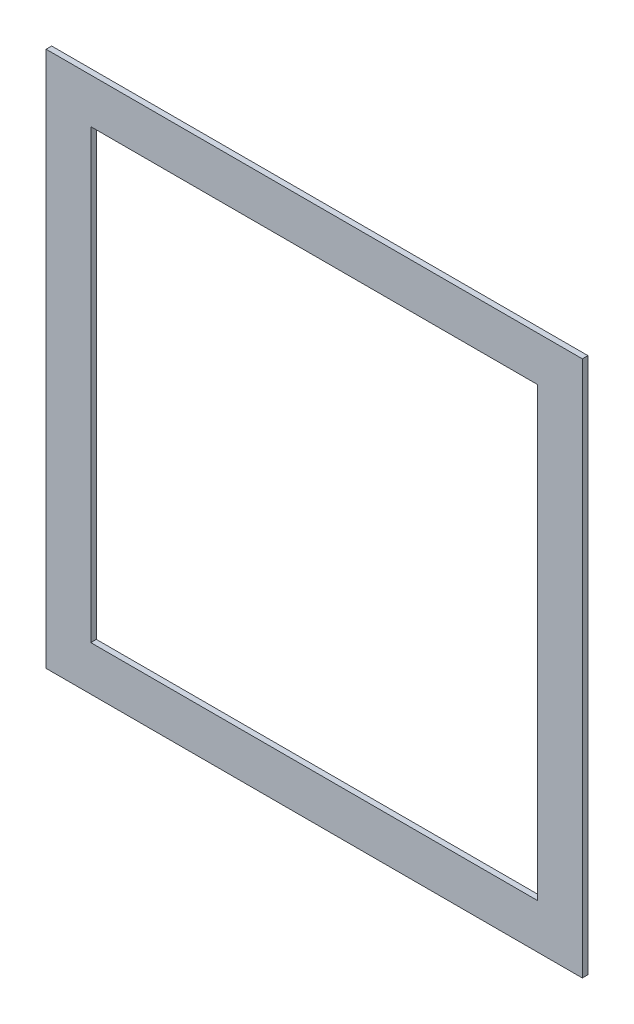
ISO-10303-21;
HEADER;
FILE_DESCRIPTION(('STEP AP214'),'2;1');
FILE_NAME('part.step','',(''),(''),'','','');
FILE_SCHEMA(('AUTOMOTIVE_DESIGN { 1 0 10303 214 1 1 1 1 }'));
ENDSEC;
DATA;
#1=APPLICATION_CONTEXT('core data for automotive mechanical design processes');
#2=APPLICATION_PROTOCOL_DEFINITION('international standard','automotive_design',2000,#1);
#3=PRODUCT_CONTEXT('',#1,'mechanical');
#4=PRODUCT('Part','Part','',(#3));
#5=PRODUCT_RELATED_PRODUCT_CATEGORY('part','',(#4));
#6=PRODUCT_DEFINITION_FORMATION('','',#4);
#7=PRODUCT_DEFINITION_CONTEXT('part definition',#1,'design');
#8=PRODUCT_DEFINITION('design','',#6,#7);
#9=PRODUCT_DEFINITION_SHAPE('','',#8);
#10=(LENGTH_UNIT() NAMED_UNIT(*) SI_UNIT(.MILLI.,.METRE.));
#11=(NAMED_UNIT(*) PLANE_ANGLE_UNIT() SI_UNIT($,.RADIAN.));
#12=(NAMED_UNIT(*) SI_UNIT($,.STERADIAN.) SOLID_ANGLE_UNIT());
#13=UNCERTAINTY_MEASURE_WITH_UNIT(LENGTH_MEASURE(1.E-05),#10,'distance_accuracy_value','');
#14=(GEOMETRIC_REPRESENTATION_CONTEXT(3) GLOBAL_UNCERTAINTY_ASSIGNED_CONTEXT((#13)) GLOBAL_UNIT_ASSIGNED_CONTEXT((#10,
#11,#12)) REPRESENTATION_CONTEXT('',''));
#15=CARTESIAN_POINT('',(0.,0.,0.));
#16=DIRECTION('',(0.,0.,1.));
#17=DIRECTION('',(1.,0.,0.));
#18=AXIS2_PLACEMENT_3D('',#15,#16,#17);
#19=CARTESIAN_POINT('',(0.,0.,1.5875));
#20=DIRECTION('',(0.,0.,1.));
#21=DIRECTION('',(1.,0.,0.));
#22=AXIS2_PLACEMENT_3D('',#19,#20,#21);
#23=PLANE('',#22);
#24=DIRECTION('',(0.,-1.,0.));
#25=VECTOR('',#24,1.);
#26=CARTESIAN_POINT('',(-69.0767187367717,47.3733934432523,1.5875));
#27=LINE('',#26,#25);
#28=CARTESIAN_POINT('',(-69.0767187367717,47.3733934432523,1.5875));
#29=VERTEX_POINT('',#28);
#30=CARTESIAN_POINT('',(-69.0767187367717,-105.026606556748,1.5875));
#31=VERTEX_POINT('',#30);
#32=EDGE_CURVE('E135',#29,#31,#27,.T.);
#33=ORIENTED_EDGE('',*,*,#32,.T.);
#34=DIRECTION('',(1.,0.,0.));
#35=VECTOR('',#34,1.);
#36=CARTESIAN_POINT('',(-69.0767187367717,-105.026606556748,1.5875));
#37=LINE('',#36,#35);
#38=CARTESIAN_POINT('',(83.3232812632284,-105.026606556748,1.5875));
#39=VERTEX_POINT('',#38);
#40=EDGE_CURVE('E138',#31,#39,#37,.T.);
#41=ORIENTED_EDGE('',*,*,#40,.T.);
#42=DIRECTION('',(0.,1.,0.));
#43=VECTOR('',#42,1.);
#44=CARTESIAN_POINT('',(83.3232812632283,47.3733934432523,1.5875));
#45=LINE('',#44,#43);
#46=CARTESIAN_POINT('',(83.3232812632283,47.3733934432523,1.5875));
#47=VERTEX_POINT('',#46);
#48=EDGE_CURVE('E141',#39,#47,#45,.T.);
#49=ORIENTED_EDGE('',*,*,#48,.T.);
#50=DIRECTION('',(-1.,0.,0.));
#51=VECTOR('',#50,1.);
#52=CARTESIAN_POINT('',(-69.0767187367717,47.3733934432523,1.5875));
#53=LINE('',#52,#51);
#54=EDGE_CURVE('E143',#47,#29,#53,.T.);
#55=ORIENTED_EDGE('',*,*,#54,.T.);
#56=EDGE_LOOP('',(#33,#41,#49,#55));
#57=FACE_BOUND('',#56,.T.);
#58=DIRECTION('',(1.,0.,0.));
#59=VECTOR('',#58,1.);
#60=CARTESIAN_POINT('',(-56.3767187367716,-92.3266065567477,1.5875));
#61=LINE('',#60,#59);
#62=CARTESIAN_POINT('',(-56.3767187367716,-92.3266065567477,1.5875));
#63=VERTEX_POINT('',#62);
#64=CARTESIAN_POINT('',(70.6232812632284,-92.3266065567477,1.5875));
#65=VERTEX_POINT('',#64);
#66=EDGE_CURVE('E107',#63,#65,#61,.T.);
#67=ORIENTED_EDGE('',*,*,#66,.F.);
#68=DIRECTION('',(0.,-1.,0.));
#69=VECTOR('',#68,1.);
#70=CARTESIAN_POINT('',(-56.3767187367717,34.6733934432523,1.5875));
#71=LINE('',#70,#69);
#72=CARTESIAN_POINT('',(-56.3767187367717,34.6733934432523,1.5875));
#73=VERTEX_POINT('',#72);
#74=EDGE_CURVE('E99',#73,#63,#71,.T.);
#75=ORIENTED_EDGE('',*,*,#74,.F.);
#76=DIRECTION('',(-1.,0.,0.));
#77=VECTOR('',#76,1.);
#78=CARTESIAN_POINT('',(-56.3767187367717,34.6733934432523,1.5875));
#79=LINE('',#78,#77);
#80=CARTESIAN_POINT('',(70.6232812632283,34.6733934432523,1.5875));
#81=VERTEX_POINT('',#80);
#82=EDGE_CURVE('E121',#81,#73,#79,.T.);
#83=ORIENTED_EDGE('',*,*,#82,.F.);
#84=DIRECTION('',(0.,1.,0.));
#85=VECTOR('',#84,1.);
#86=CARTESIAN_POINT('',(70.6232812632283,34.6733934432523,1.5875));
#87=LINE('',#86,#85);
#88=EDGE_CURVE('E119',#65,#81,#87,.T.);
#89=ORIENTED_EDGE('',*,*,#88,.F.);
#90=EDGE_LOOP('',(#67,#75,#83,#89));
#91=FACE_BOUND('',#90,.T.);
#92=ADVANCED_FACE('F34',(#57,#91),#23,.T.);
#93=CARTESIAN_POINT('',(0.,0.,0.));
#94=DIRECTION('',(0.,0.,1.));
#95=DIRECTION('',(1.,0.,0.));
#96=AXIS2_PLACEMENT_3D('',#93,#94,#95);
#97=PLANE('',#96);
#98=DIRECTION('',(0.,-1.,0.));
#99=VECTOR('',#98,1.);
#100=CARTESIAN_POINT('',(-69.0767187367717,47.3733934432523,0.));
#101=LINE('',#100,#99);
#102=CARTESIAN_POINT('',(-69.0767187367717,47.3733934432523,0.));
#103=VERTEX_POINT('',#102);
#104=CARTESIAN_POINT('',(-69.0767187367717,-105.026606556748,0.));
#105=VERTEX_POINT('',#104);
#106=EDGE_CURVE('E115',#103,#105,#101,.T.);
#107=ORIENTED_EDGE('',*,*,#106,.F.);
#108=DIRECTION('',(-1.,0.,0.));
#109=VECTOR('',#108,1.);
#110=CARTESIAN_POINT('',(-69.0767187367717,47.3733934432523,0.));
#111=LINE('',#110,#109);
#112=CARTESIAN_POINT('',(83.3232812632283,47.3733934432523,0.));
#113=VERTEX_POINT('',#112);
#114=EDGE_CURVE('E139',#113,#103,#111,.T.);
#115=ORIENTED_EDGE('',*,*,#114,.F.);
#116=DIRECTION('',(0.,1.,0.));
#117=VECTOR('',#116,1.);
#118=CARTESIAN_POINT('',(83.3232812632283,47.3733934432523,0.));
#119=LINE('',#118,#117);
#120=CARTESIAN_POINT('',(83.3232812632284,-105.026606556748,0.));
#121=VERTEX_POINT('',#120);
#122=EDGE_CURVE('E150',#121,#113,#119,.T.);
#123=ORIENTED_EDGE('',*,*,#122,.F.);
#124=DIRECTION('',(1.,0.,0.));
#125=VECTOR('',#124,1.);
#126=CARTESIAN_POINT('',(-69.0767187367717,-105.026606556748,0.));
#127=LINE('',#126,#125);
#128=EDGE_CURVE('E148',#105,#121,#127,.T.);
#129=ORIENTED_EDGE('',*,*,#128,.F.);
#130=EDGE_LOOP('',(#107,#115,#123,#129));
#131=FACE_BOUND('',#130,.T.);
#132=DIRECTION('',(0.,-1.,0.));
#133=VECTOR('',#132,1.);
#134=CARTESIAN_POINT('',(-56.3767187367717,34.6733934432523,0.));
#135=LINE('',#134,#133);
#136=CARTESIAN_POINT('',(-56.3767187367717,34.6733934432523,0.));
#137=VERTEX_POINT('',#136);
#138=CARTESIAN_POINT('',(-56.3767187367716,-92.3266065567477,0.));
#139=VERTEX_POINT('',#138);
#140=EDGE_CURVE('E57',#137,#139,#135,.T.);
#141=ORIENTED_EDGE('',*,*,#140,.T.);
#142=DIRECTION('',(1.,0.,0.));
#143=VECTOR('',#142,1.);
#144=CARTESIAN_POINT('',(-56.3767187367716,-92.3266065567477,0.));
#145=LINE('',#144,#143);
#146=CARTESIAN_POINT('',(70.6232812632284,-92.3266065567477,0.));
#147=VERTEX_POINT('',#146);
#148=EDGE_CURVE('E114',#139,#147,#145,.T.);
#149=ORIENTED_EDGE('',*,*,#148,.T.);
#150=DIRECTION('',(0.,1.,0.));
#151=VECTOR('',#150,1.);
#152=CARTESIAN_POINT('',(70.6232812632283,34.6733934432523,0.));
#153=LINE('',#152,#151);
#154=CARTESIAN_POINT('',(70.6232812632283,34.6733934432523,0.));
#155=VERTEX_POINT('',#154);
#156=EDGE_CURVE('E127',#147,#155,#153,.T.);
#157=ORIENTED_EDGE('',*,*,#156,.T.);
#158=DIRECTION('',(-1.,0.,0.));
#159=VECTOR('',#158,1.);
#160=CARTESIAN_POINT('',(-56.3767187367717,34.6733934432523,0.));
#161=LINE('',#160,#159);
#162=EDGE_CURVE('E108',#155,#137,#161,.T.);
#163=ORIENTED_EDGE('',*,*,#162,.T.);
#164=EDGE_LOOP('',(#141,#149,#157,#163));
#165=FACE_BOUND('',#164,.T.);
#166=ADVANCED_FACE('F168',(#131,#165),#97,.F.);
#167=CARTESIAN_POINT('',(-69.0767187367717,47.3733934432523,1.5875));
#168=DIRECTION('',(1.,0.,0.));
#169=DIRECTION('',(0.,1.,0.));
#170=AXIS2_PLACEMENT_3D('',#167,#168,#169);
#171=PLANE('',#170);
#172=ORIENTED_EDGE('',*,*,#106,.T.);
#173=DIRECTION('',(0.,0.,-1.));
#174=VECTOR('',#173,1.);
#175=CARTESIAN_POINT('',(-69.0767187367717,-105.026606556748,1.5875));
#176=LINE('',#175,#174);
#177=EDGE_CURVE('E11',#31,#105,#176,.T.);
#178=ORIENTED_EDGE('',*,*,#177,.F.);
#179=ORIENTED_EDGE('',*,*,#32,.F.);
#180=DIRECTION('',(0.,0.,-1.));
#181=VECTOR('',#180,1.);
#182=CARTESIAN_POINT('',(-69.0767187367717,47.3733934432523,1.5875));
#183=LINE('',#182,#181);
#184=EDGE_CURVE('E145',#29,#103,#183,.T.);
#185=ORIENTED_EDGE('',*,*,#184,.T.);
#186=EDGE_LOOP('',(#172,#178,#179,#185));
#187=FACE_BOUND('',#186,.T.);
#188=ADVANCED_FACE('F36',(#187),#171,.F.);
#189=CARTESIAN_POINT('',(-69.0767187367717,-105.026606556748,1.5875));
#190=DIRECTION('',(0.,1.,0.));
#191=DIRECTION('',(0.,0.,1.));
#192=AXIS2_PLACEMENT_3D('',#189,#190,#191);
#193=PLANE('',#192);
#194=ORIENTED_EDGE('',*,*,#128,.T.);
#195=DIRECTION('',(0.,0.,-1.));
#196=VECTOR('',#195,1.);
#197=CARTESIAN_POINT('',(83.3232812632284,-105.026606556748,1.5875));
#198=LINE('',#197,#196);
#199=EDGE_CURVE('E42',#39,#121,#198,.T.);
#200=ORIENTED_EDGE('',*,*,#199,.F.);
#201=ORIENTED_EDGE('',*,*,#40,.F.);
#202=ORIENTED_EDGE('',*,*,#177,.T.);
#203=EDGE_LOOP('',(#194,#200,#201,#202));
#204=FACE_BOUND('',#203,.T.);
#205=ADVANCED_FACE('F178',(#204),#193,.F.);
#206=CARTESIAN_POINT('',(83.3232812632283,47.3733934432523,1.5875));
#207=DIRECTION('',(-1.,0.,0.));
#208=DIRECTION('',(0.,-1.,0.));
#209=AXIS2_PLACEMENT_3D('',#206,#207,#208);
#210=PLANE('',#209);
#211=ORIENTED_EDGE('',*,*,#122,.T.);
#212=DIRECTION('',(0.,0.,-1.));
#213=VECTOR('',#212,1.);
#214=CARTESIAN_POINT('',(83.3232812632283,47.3733934432523,1.5875));
#215=LINE('',#214,#213);
#216=EDGE_CURVE('E155',#47,#113,#215,.T.);
#217=ORIENTED_EDGE('',*,*,#216,.F.);
#218=ORIENTED_EDGE('',*,*,#48,.F.);
#219=ORIENTED_EDGE('',*,*,#199,.T.);
#220=EDGE_LOOP('',(#211,#217,#218,#219));
#221=FACE_BOUND('',#220,.T.);
#222=ADVANCED_FACE('F162',(#221),#210,.F.);
#223=CARTESIAN_POINT('',(-69.0767187367717,47.3733934432523,1.5875));
#224=DIRECTION('',(0.,-1.,0.));
#225=DIRECTION('',(1.,0.,0.));
#226=AXIS2_PLACEMENT_3D('',#223,#224,#225);
#227=PLANE('',#226);
#228=ORIENTED_EDGE('',*,*,#114,.T.);
#229=ORIENTED_EDGE('',*,*,#184,.F.);
#230=ORIENTED_EDGE('',*,*,#54,.F.);
#231=ORIENTED_EDGE('',*,*,#216,.T.);
#232=EDGE_LOOP('',(#228,#229,#230,#231));
#233=FACE_BOUND('',#232,.T.);
#234=ADVANCED_FACE('F172',(#233),#227,.F.);
#235=CARTESIAN_POINT('',(-56.3767187367717,34.6733934432523,1.5875));
#236=DIRECTION('',(1.,0.,0.));
#237=DIRECTION('',(0.,1.,0.));
#238=AXIS2_PLACEMENT_3D('',#235,#236,#237);
#239=PLANE('',#238);
#240=ORIENTED_EDGE('',*,*,#140,.F.);
#241=DIRECTION('',(0.,0.,-1.));
#242=VECTOR('',#241,1.);
#243=CARTESIAN_POINT('',(-56.3767187367717,34.6733934432523,1.5875));
#244=LINE('',#243,#242);
#245=EDGE_CURVE('E103',#73,#137,#244,.T.);
#246=ORIENTED_EDGE('',*,*,#245,.F.);
#247=ORIENTED_EDGE('',*,*,#74,.T.);
#248=DIRECTION('',(0.,0.,-1.));
#249=VECTOR('',#248,1.);
#250=CARTESIAN_POINT('',(-56.3767187367716,-92.3266065567477,1.5875));
#251=LINE('',#250,#249);
#252=EDGE_CURVE('E102',#63,#139,#251,.T.);
#253=ORIENTED_EDGE('',*,*,#252,.T.);
#254=EDGE_LOOP('',(#240,#246,#247,#253));
#255=FACE_BOUND('',#254,.T.);
#256=ADVANCED_FACE('F101',(#255),#239,.T.);
#257=CARTESIAN_POINT('',(-56.3767187367716,-92.3266065567477,1.5875));
#258=DIRECTION('',(0.,1.,0.));
#259=DIRECTION('',(0.,0.,1.));
#260=AXIS2_PLACEMENT_3D('',#257,#258,#259);
#261=PLANE('',#260);
#262=ORIENTED_EDGE('',*,*,#148,.F.);
#263=ORIENTED_EDGE('',*,*,#252,.F.);
#264=ORIENTED_EDGE('',*,*,#66,.T.);
#265=DIRECTION('',(0.,0.,-1.));
#266=VECTOR('',#265,1.);
#267=CARTESIAN_POINT('',(70.6232812632284,-92.3266065567477,1.5875));
#268=LINE('',#267,#266);
#269=EDGE_CURVE('E116',#65,#147,#268,.T.);
#270=ORIENTED_EDGE('',*,*,#269,.T.);
#271=EDGE_LOOP('',(#262,#263,#264,#270));
#272=FACE_BOUND('',#271,.T.);
#273=ADVANCED_FACE('F111',(#272),#261,.T.);
#274=CARTESIAN_POINT('',(70.6232812632283,34.6733934432523,1.5875));
#275=DIRECTION('',(-1.,0.,0.));
#276=DIRECTION('',(0.,-1.,0.));
#277=AXIS2_PLACEMENT_3D('',#274,#275,#276);
#278=PLANE('',#277);
#279=ORIENTED_EDGE('',*,*,#156,.F.);
#280=ORIENTED_EDGE('',*,*,#269,.F.);
#281=ORIENTED_EDGE('',*,*,#88,.T.);
#282=DIRECTION('',(0.,0.,-1.));
#283=VECTOR('',#282,1.);
#284=CARTESIAN_POINT('',(70.6232812632283,34.6733934432523,1.5875));
#285=LINE('',#284,#283);
#286=EDGE_CURVE('E49',#81,#155,#285,.T.);
#287=ORIENTED_EDGE('',*,*,#286,.T.);
#288=EDGE_LOOP('',(#279,#280,#281,#287));
#289=FACE_BOUND('',#288,.T.);
#290=ADVANCED_FACE('F201',(#289),#278,.T.);
#291=CARTESIAN_POINT('',(-56.3767187367717,34.6733934432523,1.5875));
#292=DIRECTION('',(0.,-1.,0.));
#293=DIRECTION('',(0.,0.,-1.));
#294=AXIS2_PLACEMENT_3D('',#291,#292,#293);
#295=PLANE('',#294);
#296=ORIENTED_EDGE('',*,*,#162,.F.);
#297=ORIENTED_EDGE('',*,*,#286,.F.);
#298=ORIENTED_EDGE('',*,*,#82,.T.);
#299=ORIENTED_EDGE('',*,*,#245,.T.);
#300=EDGE_LOOP('',(#296,#297,#298,#299));
#301=FACE_BOUND('',#300,.T.);
#302=ADVANCED_FACE('F205',(#301),#295,.T.);
#303=CLOSED_SHELL('',(#92,#166,#188,#205,#222,#234,#256,#273,#290,#302));
#304=MANIFOLD_SOLID_BREP('B2',#303);
#305=ADVANCED_BREP_SHAPE_REPRESENTATION('',(#18,#304),#14);
#306=SHAPE_DEFINITION_REPRESENTATION(#9,#305);
ENDSEC;
END-ISO-10303-21;
